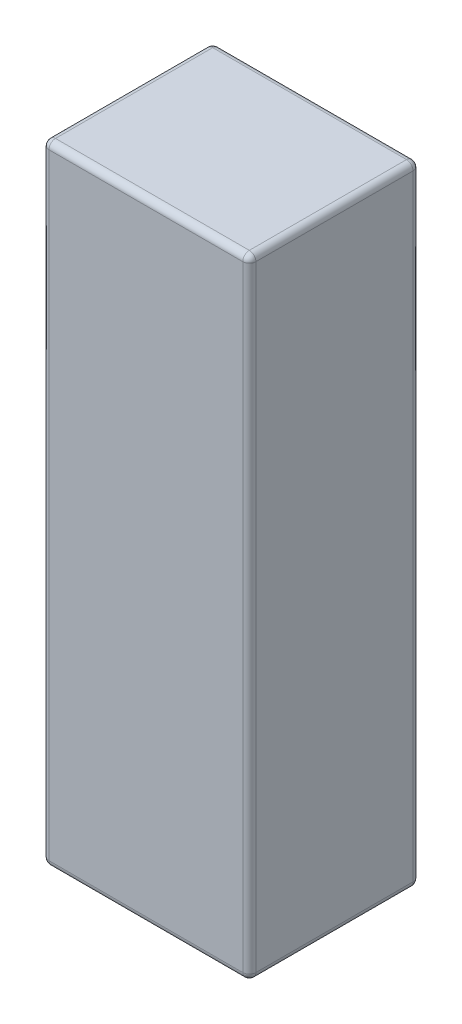
ISO-10303-21;
HEADER;
FILE_DESCRIPTION(('STEP AP214'),'2;1');
FILE_NAME('part.step','',(''),(''),'','','');
FILE_SCHEMA(('AUTOMOTIVE_DESIGN { 1 0 10303 214 1 1 1 1 }'));
ENDSEC;
DATA;
#1=APPLICATION_CONTEXT('core data for automotive mechanical design processes');
#2=APPLICATION_PROTOCOL_DEFINITION('international standard','automotive_design',2000,#1);
#3=PRODUCT_CONTEXT('',#1,'mechanical');
#4=PRODUCT('Part','Part','',(#3));
#5=PRODUCT_RELATED_PRODUCT_CATEGORY('part','',(#4));
#6=PRODUCT_DEFINITION_FORMATION('','',#4);
#7=PRODUCT_DEFINITION_CONTEXT('part definition',#1,'design');
#8=PRODUCT_DEFINITION('design','',#6,#7);
#9=PRODUCT_DEFINITION_SHAPE('','',#8);
#10=(LENGTH_UNIT() NAMED_UNIT(*) SI_UNIT(.MILLI.,.METRE.));
#11=(NAMED_UNIT(*) PLANE_ANGLE_UNIT() SI_UNIT($,.RADIAN.));
#12=(NAMED_UNIT(*) SI_UNIT($,.STERADIAN.) SOLID_ANGLE_UNIT());
#13=UNCERTAINTY_MEASURE_WITH_UNIT(LENGTH_MEASURE(1.E-05),#10,'distance_accuracy_value','');
#14=(GEOMETRIC_REPRESENTATION_CONTEXT(3) GLOBAL_UNCERTAINTY_ASSIGNED_CONTEXT((#13)) GLOBAL_UNIT_ASSIGNED_CONTEXT((#10,
#11,#12)) REPRESENTATION_CONTEXT('',''));
#15=CARTESIAN_POINT('',(0.,0.,0.));
#16=DIRECTION('',(0.,0.,1.));
#17=DIRECTION('',(1.,0.,0.));
#18=AXIS2_PLACEMENT_3D('',#15,#16,#17);
#19=CARTESIAN_POINT('',(7.9,48.,-6.5));
#20=DIRECTION('',(-1.,0.,0.));
#21=DIRECTION('',(0.,0.,1.));
#22=AXIS2_PLACEMENT_3D('',#19,#20,#21);
#23=PLANE('',#22);
#24=DIRECTION('',(0.,-1.,0.));
#25=VECTOR('',#24,1.);
#26=CARTESIAN_POINT('',(7.9,48.,-6.));
#27=LINE('',#26,#25);
#28=CARTESIAN_POINT('',(7.9,0.5,-6.));
#29=VERTEX_POINT('',#28);
#30=CARTESIAN_POINT('',(7.9,47.5,-6.));
#31=VERTEX_POINT('',#30);
#32=EDGE_CURVE('E167',#29,#31,#27,.F.);
#33=ORIENTED_EDGE('',*,*,#32,.T.);
#34=DIRECTION('',(0.,0.,-1.));
#35=VECTOR('',#34,1.);
#36=CARTESIAN_POINT('',(7.9,47.5,6.5));
#37=LINE('',#36,#35);
#38=CARTESIAN_POINT('',(7.9,47.5,6.));
#39=VERTEX_POINT('',#38);
#40=EDGE_CURVE('E136',#31,#39,#37,.F.);
#41=ORIENTED_EDGE('',*,*,#40,.T.);
#42=DIRECTION('',(0.,-1.,0.));
#43=VECTOR('',#42,1.);
#44=CARTESIAN_POINT('',(7.9,48.,6.));
#45=LINE('',#44,#43);
#46=CARTESIAN_POINT('',(7.9,0.5,6.));
#47=VERTEX_POINT('',#46);
#48=EDGE_CURVE('E178',#39,#47,#45,.T.);
#49=ORIENTED_EDGE('',*,*,#48,.T.);
#50=DIRECTION('',(0.,0.,-1.));
#51=VECTOR('',#50,1.);
#52=CARTESIAN_POINT('',(7.9,0.5,-6.5));
#53=LINE('',#52,#51);
#54=EDGE_CURVE('E171',#47,#29,#53,.T.);
#55=ORIENTED_EDGE('',*,*,#54,.T.);
#56=EDGE_LOOP('',(#33,#41,#49,#55));
#57=FACE_BOUND('',#56,.T.);
#58=ADVANCED_FACE('F39',(#57),#23,.F.);
#59=CARTESIAN_POINT('',(-7.9,48.,-6.5));
#60=DIRECTION('',(0.,0.,1.));
#61=DIRECTION('',(1.,0.,0.));
#62=AXIS2_PLACEMENT_3D('',#59,#60,#61);
#63=PLANE('',#62);
#64=DIRECTION('',(-1.,0.,0.));
#65=VECTOR('',#64,1.);
#66=CARTESIAN_POINT('',(7.9,47.5,-6.5));
#67=LINE('',#66,#65);
#68=CARTESIAN_POINT('',(-7.4,47.5,-6.5));
#69=VERTEX_POINT('',#68);
#70=CARTESIAN_POINT('',(7.4,47.5,-6.5));
#71=VERTEX_POINT('',#70);
#72=EDGE_CURVE('E49',#69,#71,#67,.F.);
#73=ORIENTED_EDGE('',*,*,#72,.T.);
#74=DIRECTION('',(0.,-1.,0.));
#75=VECTOR('',#74,1.);
#76=CARTESIAN_POINT('',(7.4,48.,-6.5));
#77=LINE('',#76,#75);
#78=CARTESIAN_POINT('',(7.4,0.5,-6.5));
#79=VERTEX_POINT('',#78);
#80=EDGE_CURVE('E11',#71,#79,#77,.T.);
#81=ORIENTED_EDGE('',*,*,#80,.T.);
#82=DIRECTION('',(-1.,0.,0.));
#83=VECTOR('',#82,1.);
#84=CARTESIAN_POINT('',(-7.9,0.5,-6.5));
#85=LINE('',#84,#83);
#86=CARTESIAN_POINT('',(-7.4,0.5,-6.5));
#87=VERTEX_POINT('',#86);
#88=EDGE_CURVE('E222',#79,#87,#85,.T.);
#89=ORIENTED_EDGE('',*,*,#88,.T.);
#90=DIRECTION('',(0.,-1.,0.));
#91=VECTOR('',#90,1.);
#92=CARTESIAN_POINT('',(-7.4,48.,-6.5));
#93=LINE('',#92,#91);
#94=EDGE_CURVE('E60',#87,#69,#93,.F.);
#95=ORIENTED_EDGE('',*,*,#94,.T.);
#96=EDGE_LOOP('',(#73,#81,#89,#95));
#97=FACE_BOUND('',#96,.T.);
#98=ADVANCED_FACE('F374',(#97),#63,.F.);
#99=CARTESIAN_POINT('',(-7.9,48.,-6.5));
#100=DIRECTION('',(1.,0.,0.));
#101=DIRECTION('',(0.,0.,-1.));
#102=AXIS2_PLACEMENT_3D('',#99,#100,#101);
#103=PLANE('',#102);
#104=DIRECTION('',(0.,-1.,0.));
#105=VECTOR('',#104,1.);
#106=CARTESIAN_POINT('',(-7.9,48.,6.));
#107=LINE('',#106,#105);
#108=CARTESIAN_POINT('',(-7.9,0.5,6.));
#109=VERTEX_POINT('',#108);
#110=CARTESIAN_POINT('',(-7.9,47.5,6.));
#111=VERTEX_POINT('',#110);
#112=EDGE_CURVE('E215',#109,#111,#107,.F.);
#113=ORIENTED_EDGE('',*,*,#112,.T.);
#114=DIRECTION('',(0.,0.,1.));
#115=VECTOR('',#114,1.);
#116=CARTESIAN_POINT('',(-7.9,47.5,-6.5));
#117=LINE('',#116,#115);
#118=CARTESIAN_POINT('',(-7.9,47.5,-6.));
#119=VERTEX_POINT('',#118);
#120=EDGE_CURVE('E218',#111,#119,#117,.F.);
#121=ORIENTED_EDGE('',*,*,#120,.T.);
#122=DIRECTION('',(0.,-1.,0.));
#123=VECTOR('',#122,1.);
#124=CARTESIAN_POINT('',(-7.9,48.,-6.));
#125=LINE('',#124,#123);
#126=CARTESIAN_POINT('',(-7.9,0.5,-6.));
#127=VERTEX_POINT('',#126);
#128=EDGE_CURVE('E209',#119,#127,#125,.T.);
#129=ORIENTED_EDGE('',*,*,#128,.T.);
#130=DIRECTION('',(0.,0.,1.));
#131=VECTOR('',#130,1.);
#132=CARTESIAN_POINT('',(-7.9,0.5,-6.5));
#133=LINE('',#132,#131);
#134=EDGE_CURVE('E212',#127,#109,#133,.T.);
#135=ORIENTED_EDGE('',*,*,#134,.T.);
#136=EDGE_LOOP('',(#113,#121,#129,#135));
#137=FACE_BOUND('',#136,.T.);
#138=ADVANCED_FACE('F353',(#137),#103,.F.);
#139=CARTESIAN_POINT('',(-7.9,48.,6.5));
#140=DIRECTION('',(0.,0.,-1.));
#141=DIRECTION('',(-1.,0.,0.));
#142=AXIS2_PLACEMENT_3D('',#139,#140,#141);
#143=PLANE('',#142);
#144=DIRECTION('',(0.,-1.,0.));
#145=VECTOR('',#144,1.);
#146=CARTESIAN_POINT('',(7.4,48.,6.5));
#147=LINE('',#146,#145);
#148=CARTESIAN_POINT('',(7.4,0.5,6.5));
#149=VERTEX_POINT('',#148);
#150=CARTESIAN_POINT('',(7.4,47.5,6.5));
#151=VERTEX_POINT('',#150);
#152=EDGE_CURVE('E189',#149,#151,#147,.F.);
#153=ORIENTED_EDGE('',*,*,#152,.T.);
#154=DIRECTION('',(1.,0.,0.));
#155=VECTOR('',#154,1.);
#156=CARTESIAN_POINT('',(-7.9,47.5,6.5));
#157=LINE('',#156,#155);
#158=CARTESIAN_POINT('',(-7.4,47.5,6.5));
#159=VERTEX_POINT('',#158);
#160=EDGE_CURVE('E192',#151,#159,#157,.F.);
#161=ORIENTED_EDGE('',*,*,#160,.T.);
#162=DIRECTION('',(0.,-1.,0.));
#163=VECTOR('',#162,1.);
#164=CARTESIAN_POINT('',(-7.4,48.,6.5));
#165=LINE('',#164,#163);
#166=CARTESIAN_POINT('',(-7.4,0.5,6.5));
#167=VERTEX_POINT('',#166);
#168=EDGE_CURVE('E183',#159,#167,#165,.T.);
#169=ORIENTED_EDGE('',*,*,#168,.T.);
#170=DIRECTION('',(1.,0.,0.));
#171=VECTOR('',#170,1.);
#172=CARTESIAN_POINT('',(-7.9,0.5,6.5));
#173=LINE('',#172,#171);
#174=EDGE_CURVE('E186',#167,#149,#173,.T.);
#175=ORIENTED_EDGE('',*,*,#174,.T.);
#176=EDGE_LOOP('',(#153,#161,#169,#175));
#177=FACE_BOUND('',#176,.T.);
#178=ADVANCED_FACE('F339',(#177),#143,.F.);
#179=CARTESIAN_POINT('',(0.,48.,0.));
#180=DIRECTION('',(0.,1.,0.));
#181=DIRECTION('',(0.,0.,1.));
#182=AXIS2_PLACEMENT_3D('',#179,#180,#181);
#183=PLANE('',#182);
#184=DIRECTION('',(1.,0.,0.));
#185=VECTOR('',#184,1.);
#186=CARTESIAN_POINT('',(7.9,48.,6.));
#187=LINE('',#186,#185);
#188=CARTESIAN_POINT('',(-7.4,48.,6.));
#189=VERTEX_POINT('',#188);
#190=CARTESIAN_POINT('',(7.4,48.,6.));
#191=VERTEX_POINT('',#190);
#192=EDGE_CURVE('E164',#189,#191,#187,.T.);
#193=ORIENTED_EDGE('',*,*,#192,.T.);
#194=DIRECTION('',(0.,0.,-1.));
#195=VECTOR('',#194,1.);
#196=CARTESIAN_POINT('',(7.4,48.,-6.5));
#197=LINE('',#196,#195);
#198=CARTESIAN_POINT('',(7.4,48.,-6.));
#199=VERTEX_POINT('',#198);
#200=EDGE_CURVE('E134',#191,#199,#197,.T.);
#201=ORIENTED_EDGE('',*,*,#200,.T.);
#202=DIRECTION('',(-1.,0.,0.));
#203=VECTOR('',#202,1.);
#204=CARTESIAN_POINT('',(-7.9,48.,-6.));
#205=LINE('',#204,#203);
#206=CARTESIAN_POINT('',(-7.4,48.,-6.));
#207=VERTEX_POINT('',#206);
#208=EDGE_CURVE('E153',#199,#207,#205,.T.);
#209=ORIENTED_EDGE('',*,*,#208,.T.);
#210=DIRECTION('',(0.,0.,1.));
#211=VECTOR('',#210,1.);
#212=CARTESIAN_POINT('',(-7.4,48.,6.5));
#213=LINE('',#212,#211);
#214=EDGE_CURVE('E160',#207,#189,#213,.T.);
#215=ORIENTED_EDGE('',*,*,#214,.T.);
#216=EDGE_LOOP('',(#193,#201,#209,#215));
#217=FACE_BOUND('',#216,.T.);
#218=ADVANCED_FACE('F162',(#217),#183,.T.);
#219=CARTESIAN_POINT('',(0.,0.,0.));
#220=DIRECTION('',(0.,1.,0.));
#221=DIRECTION('',(0.,0.,1.));
#222=AXIS2_PLACEMENT_3D('',#219,#220,#221);
#223=PLANE('',#222);
#224=DIRECTION('',(0.,0.,-1.));
#225=VECTOR('',#224,1.);
#226=CARTESIAN_POINT('',(7.4,0.,0.));
#227=LINE('',#226,#225);
#228=CARTESIAN_POINT('',(7.4,0.,-6.));
#229=VERTEX_POINT('',#228);
#230=CARTESIAN_POINT('',(7.4,0.,6.));
#231=VERTEX_POINT('',#230);
#232=EDGE_CURVE('E202',#229,#231,#227,.F.);
#233=ORIENTED_EDGE('',*,*,#232,.T.);
#234=DIRECTION('',(1.,0.,0.));
#235=VECTOR('',#234,1.);
#236=CARTESIAN_POINT('',(0.,0.,6.));
#237=LINE('',#236,#235);
#238=CARTESIAN_POINT('',(-7.4,0.,6.));
#239=VERTEX_POINT('',#238);
#240=EDGE_CURVE('E205',#231,#239,#237,.F.);
#241=ORIENTED_EDGE('',*,*,#240,.T.);
#242=DIRECTION('',(0.,0.,1.));
#243=VECTOR('',#242,1.);
#244=CARTESIAN_POINT('',(-7.4,0.,0.));
#245=LINE('',#244,#243);
#246=CARTESIAN_POINT('',(-7.4,0.,-6.));
#247=VERTEX_POINT('',#246);
#248=EDGE_CURVE('E199',#239,#247,#245,.F.);
#249=ORIENTED_EDGE('',*,*,#248,.T.);
#250=DIRECTION('',(-1.,0.,0.));
#251=VECTOR('',#250,1.);
#252=CARTESIAN_POINT('',(0.,0.,-6.));
#253=LINE('',#252,#251);
#254=EDGE_CURVE('E196',#247,#229,#253,.F.);
#255=ORIENTED_EDGE('',*,*,#254,.T.);
#256=EDGE_LOOP('',(#233,#241,#249,#255));
#257=FACE_BOUND('',#256,.T.);
#258=ADVANCED_FACE('F318',(#257),#223,.F.);
#259=CARTESIAN_POINT('',(-7.4,0.5,-6.5));
#260=DIRECTION('',(0.,0.,1.));
#261=DIRECTION('',(1.,0.,0.));
#262=AXIS2_PLACEMENT_3D('',#259,#260,#261);
#263=CYLINDRICAL_SURFACE('',#262,0.5);
#264=CARTESIAN_POINT('',(-7.4,0.5,6.));
#265=DIRECTION('',(0.,0.,1.));
#266=DIRECTION('',(1.,0.,0.));
#267=AXIS2_PLACEMENT_3D('',#264,#265,#266);
#268=CIRCLE('',#267,0.5);
#269=EDGE_CURVE('E43',#109,#239,#268,.T.);
#270=ORIENTED_EDGE('',*,*,#269,.F.);
#271=ORIENTED_EDGE('',*,*,#134,.F.);
#272=CARTESIAN_POINT('',(-7.4,0.5,-6.));
#273=DIRECTION('',(0.,0.,-1.));
#274=DIRECTION('',(-1.,0.,0.));
#275=AXIS2_PLACEMENT_3D('',#272,#273,#274);
#276=CIRCLE('',#275,0.5);
#277=EDGE_CURVE('E297',#247,#127,#276,.T.);
#278=ORIENTED_EDGE('',*,*,#277,.F.);
#279=ORIENTED_EDGE('',*,*,#248,.F.);
#280=EDGE_LOOP('',(#270,#271,#278,#279));
#281=FACE_BOUND('',#280,.T.);
#282=ADVANCED_FACE('F41',(#281),#263,.T.);
#283=CARTESIAN_POINT('',(-7.4,0.5,6.));
#284=DIRECTION('',(0.,0.,1.));
#285=DIRECTION('',(1.,0.,0.));
#286=AXIS2_PLACEMENT_3D('',#283,#284,#285);
#287=SPHERICAL_SURFACE('',#286,0.5);
#288=CARTESIAN_POINT('',(-7.4,0.5,6.));
#289=DIRECTION('',(0.,-1.,0.));
#290=DIRECTION('',(0.,0.,-1.));
#291=AXIS2_PLACEMENT_3D('',#288,#289,#290);
#292=CIRCLE('',#291,0.5);
#293=EDGE_CURVE('E291',#109,#167,#292,.F.);
#294=ORIENTED_EDGE('',*,*,#293,.F.);
#295=ORIENTED_EDGE('',*,*,#269,.T.);
#296=CARTESIAN_POINT('',(-7.4,0.5,6.));
#297=DIRECTION('',(-1.,0.,0.));
#298=DIRECTION('',(0.,0.,1.));
#299=AXIS2_PLACEMENT_3D('',#296,#297,#298);
#300=CIRCLE('',#299,0.5);
#301=EDGE_CURVE('E295',#167,#239,#300,.F.);
#302=ORIENTED_EDGE('',*,*,#301,.F.);
#303=EDGE_LOOP('',(#294,#295,#302));
#304=FACE_BOUND('',#303,.T.);
#305=ADVANCED_FACE('F311',(#304),#287,.T.);
#306=CARTESIAN_POINT('',(-7.4,0.5,-6.));
#307=DIRECTION('',(0.,0.,1.));
#308=DIRECTION('',(1.,0.,0.));
#309=AXIS2_PLACEMENT_3D('',#306,#307,#308);
#310=SPHERICAL_SURFACE('',#309,0.5);
#311=CARTESIAN_POINT('',(-7.4,0.5,-6.));
#312=DIRECTION('',(-1.,0.,0.));
#313=DIRECTION('',(0.,0.,1.));
#314=AXIS2_PLACEMENT_3D('',#311,#312,#313);
#315=CIRCLE('',#314,0.5);
#316=EDGE_CURVE('E283',#247,#87,#315,.F.);
#317=ORIENTED_EDGE('',*,*,#316,.F.);
#318=ORIENTED_EDGE('',*,*,#277,.T.);
#319=CARTESIAN_POINT('',(-7.4,0.5,-6.));
#320=DIRECTION('',(0.,-1.,0.));
#321=DIRECTION('',(0.,0.,-1.));
#322=AXIS2_PLACEMENT_3D('',#319,#320,#321);
#323=CIRCLE('',#322,0.5);
#324=EDGE_CURVE('E287',#87,#127,#323,.F.);
#325=ORIENTED_EDGE('',*,*,#324,.F.);
#326=EDGE_LOOP('',(#317,#318,#325));
#327=FACE_BOUND('',#326,.T.);
#328=ADVANCED_FACE('F361',(#327),#310,.T.);
#329=CARTESIAN_POINT('',(-7.9,0.5,6.));
#330=DIRECTION('',(1.,0.,0.));
#331=DIRECTION('',(0.,0.,-1.));
#332=AXIS2_PLACEMENT_3D('',#329,#330,#331);
#333=CYLINDRICAL_SURFACE('',#332,0.5);
#334=ORIENTED_EDGE('',*,*,#301,.T.);
#335=ORIENTED_EDGE('',*,*,#240,.F.);
#336=CARTESIAN_POINT('',(7.4,0.5,6.));
#337=DIRECTION('',(1.,0.,0.));
#338=DIRECTION('',(0.,0.,-1.));
#339=AXIS2_PLACEMENT_3D('',#336,#337,#338);
#340=CIRCLE('',#339,0.5);
#341=EDGE_CURVE('E275',#149,#231,#340,.T.);
#342=ORIENTED_EDGE('',*,*,#341,.F.);
#343=ORIENTED_EDGE('',*,*,#174,.F.);
#344=EDGE_LOOP('',(#334,#335,#342,#343));
#345=FACE_BOUND('',#344,.T.);
#346=ADVANCED_FACE('F323',(#345),#333,.T.);
#347=CARTESIAN_POINT('',(-7.4,48.,6.));
#348=DIRECTION('',(0.,-1.,0.));
#349=DIRECTION('',(0.,0.,-1.));
#350=AXIS2_PLACEMENT_3D('',#347,#348,#349);
#351=CYLINDRICAL_SURFACE('',#350,0.5);
#352=ORIENTED_EDGE('',*,*,#293,.T.);
#353=ORIENTED_EDGE('',*,*,#168,.F.);
#354=CARTESIAN_POINT('',(-7.4,47.5,6.));
#355=DIRECTION('',(0.,1.,0.));
#356=DIRECTION('',(0.,0.,1.));
#357=AXIS2_PLACEMENT_3D('',#354,#355,#356);
#358=CIRCLE('',#357,0.5);
#359=EDGE_CURVE('E271',#111,#159,#358,.T.);
#360=ORIENTED_EDGE('',*,*,#359,.F.);
#361=ORIENTED_EDGE('',*,*,#112,.F.);
#362=EDGE_LOOP('',(#352,#353,#360,#361));
#363=FACE_BOUND('',#362,.T.);
#364=ADVANCED_FACE('F350',(#363),#351,.T.);
#365=CARTESIAN_POINT('',(-7.4,47.5,0.));
#366=DIRECTION('',(0.,0.,-1.));
#367=DIRECTION('',(-1.,0.,0.));
#368=AXIS2_PLACEMENT_3D('',#365,#366,#367);
#369=CYLINDRICAL_SURFACE('',#368,0.5);
#370=CARTESIAN_POINT('',(-7.4,47.5,-6.));
#371=DIRECTION('',(0.,0.,-1.));
#372=DIRECTION('',(-1.,0.,0.));
#373=AXIS2_PLACEMENT_3D('',#370,#371,#372);
#374=CIRCLE('',#373,0.5);
#375=EDGE_CURVE('E263',#119,#207,#374,.T.);
#376=ORIENTED_EDGE('',*,*,#375,.F.);
#377=ORIENTED_EDGE('',*,*,#120,.F.);
#378=CARTESIAN_POINT('',(-7.4,47.5,6.));
#379=DIRECTION('',(0.,0.,1.));
#380=DIRECTION('',(1.,0.,0.));
#381=AXIS2_PLACEMENT_3D('',#378,#379,#380);
#382=CIRCLE('',#381,0.5);
#383=EDGE_CURVE('E267',#189,#111,#382,.T.);
#384=ORIENTED_EDGE('',*,*,#383,.F.);
#385=ORIENTED_EDGE('',*,*,#214,.F.);
#386=EDGE_LOOP('',(#376,#377,#384,#385));
#387=FACE_BOUND('',#386,.T.);
#388=ADVANCED_FACE('F356',(#387),#369,.T.);
#389=CARTESIAN_POINT('',(-7.4,48.,-6.));
#390=DIRECTION('',(0.,-1.,0.));
#391=DIRECTION('',(0.,0.,-1.));
#392=AXIS2_PLACEMENT_3D('',#389,#390,#391);
#393=CYLINDRICAL_SURFACE('',#392,0.5);
#394=ORIENTED_EDGE('',*,*,#324,.T.);
#395=ORIENTED_EDGE('',*,*,#128,.F.);
#396=CARTESIAN_POINT('',(-7.4,47.5,-6.));
#397=DIRECTION('',(0.,1.,0.));
#398=DIRECTION('',(0.,0.,1.));
#399=AXIS2_PLACEMENT_3D('',#396,#397,#398);
#400=CIRCLE('',#399,0.5);
#401=EDGE_CURVE('E260',#69,#119,#400,.T.);
#402=ORIENTED_EDGE('',*,*,#401,.F.);
#403=ORIENTED_EDGE('',*,*,#94,.F.);
#404=EDGE_LOOP('',(#394,#395,#402,#403));
#405=FACE_BOUND('',#404,.T.);
#406=ADVANCED_FACE('F360',(#405),#393,.T.);
#407=CARTESIAN_POINT('',(-7.9,0.5,-6.));
#408=DIRECTION('',(-1.,0.,0.));
#409=DIRECTION('',(0.,0.,1.));
#410=AXIS2_PLACEMENT_3D('',#407,#408,#409);
#411=CYLINDRICAL_SURFACE('',#410,0.5);
#412=ORIENTED_EDGE('',*,*,#316,.T.);
#413=ORIENTED_EDGE('',*,*,#88,.F.);
#414=CARTESIAN_POINT('',(7.4,0.5,-6.));
#415=DIRECTION('',(1.,0.,0.));
#416=DIRECTION('',(0.,0.,-1.));
#417=AXIS2_PLACEMENT_3D('',#414,#415,#416);
#418=CIRCLE('',#417,0.5);
#419=EDGE_CURVE('E256',#229,#79,#418,.T.);
#420=ORIENTED_EDGE('',*,*,#419,.F.);
#421=ORIENTED_EDGE('',*,*,#254,.F.);
#422=EDGE_LOOP('',(#412,#413,#420,#421));
#423=FACE_BOUND('',#422,.T.);
#424=ADVANCED_FACE('F365',(#423),#411,.T.);
#425=CARTESIAN_POINT('',(7.4,0.5,-6.5));
#426=DIRECTION('',(0.,0.,-1.));
#427=DIRECTION('',(-1.,0.,0.));
#428=AXIS2_PLACEMENT_3D('',#425,#426,#427);
#429=CYLINDRICAL_SURFACE('',#428,0.5);
#430=CARTESIAN_POINT('',(7.4,0.5,6.));
#431=DIRECTION('',(0.,0.,1.));
#432=DIRECTION('',(1.,0.,0.));
#433=AXIS2_PLACEMENT_3D('',#430,#431,#432);
#434=CIRCLE('',#433,0.5);
#435=EDGE_CURVE('E279',#231,#47,#434,.T.);
#436=ORIENTED_EDGE('',*,*,#435,.F.);
#437=ORIENTED_EDGE('',*,*,#232,.F.);
#438=CARTESIAN_POINT('',(7.4,0.5,-6.));
#439=DIRECTION('',(0.,0.,-1.));
#440=DIRECTION('',(-1.,0.,0.));
#441=AXIS2_PLACEMENT_3D('',#438,#439,#440);
#442=CIRCLE('',#441,0.5);
#443=EDGE_CURVE('E252',#29,#229,#442,.T.);
#444=ORIENTED_EDGE('',*,*,#443,.F.);
#445=ORIENTED_EDGE('',*,*,#54,.F.);
#446=EDGE_LOOP('',(#436,#437,#444,#445));
#447=FACE_BOUND('',#446,.T.);
#448=ADVANCED_FACE('F327',(#447),#429,.T.);
#449=CARTESIAN_POINT('',(7.4,0.5,6.));
#450=DIRECTION('',(0.,0.,1.));
#451=DIRECTION('',(1.,0.,0.));
#452=AXIS2_PLACEMENT_3D('',#449,#450,#451);
#453=SPHERICAL_SURFACE('',#452,0.5);
#454=ORIENTED_EDGE('',*,*,#341,.T.);
#455=ORIENTED_EDGE('',*,*,#435,.T.);
#456=CARTESIAN_POINT('',(7.4,0.5,6.));
#457=DIRECTION('',(0.,-1.,0.));
#458=DIRECTION('',(0.,0.,-1.));
#459=AXIS2_PLACEMENT_3D('',#456,#457,#458);
#460=CIRCLE('',#459,0.5);
#461=EDGE_CURVE('E248',#149,#47,#460,.F.);
#462=ORIENTED_EDGE('',*,*,#461,.F.);
#463=EDGE_LOOP('',(#454,#455,#462));
#464=FACE_BOUND('',#463,.T.);
#465=ADVANCED_FACE('F331',(#464),#453,.T.);
#466=CARTESIAN_POINT('',(-7.4,47.5,6.));
#467=DIRECTION('',(0.,0.,1.));
#468=DIRECTION('',(1.,0.,0.));
#469=AXIS2_PLACEMENT_3D('',#466,#467,#468);
#470=SPHERICAL_SURFACE('',#469,0.5);
#471=ORIENTED_EDGE('',*,*,#383,.T.);
#472=ORIENTED_EDGE('',*,*,#359,.T.);
#473=CARTESIAN_POINT('',(-7.4,47.5,6.));
#474=DIRECTION('',(-1.,0.,0.));
#475=DIRECTION('',(0.,0.,1.));
#476=AXIS2_PLACEMENT_3D('',#473,#474,#475);
#477=CIRCLE('',#476,0.5);
#478=EDGE_CURVE('E245',#189,#159,#477,.F.);
#479=ORIENTED_EDGE('',*,*,#478,.F.);
#480=EDGE_LOOP('',(#471,#472,#479));
#481=FACE_BOUND('',#480,.T.);
#482=ADVANCED_FACE('F347',(#481),#470,.T.);
#483=CARTESIAN_POINT('',(-7.4,47.5,-6.));
#484=DIRECTION('',(0.,0.,1.));
#485=DIRECTION('',(1.,0.,0.));
#486=AXIS2_PLACEMENT_3D('',#483,#484,#485);
#487=SPHERICAL_SURFACE('',#486,0.5);
#488=ORIENTED_EDGE('',*,*,#401,.T.);
#489=ORIENTED_EDGE('',*,*,#375,.T.);
#490=CARTESIAN_POINT('',(-7.4,47.5,-6.));
#491=DIRECTION('',(-1.,0.,0.));
#492=DIRECTION('',(0.,0.,1.));
#493=AXIS2_PLACEMENT_3D('',#490,#491,#492);
#494=CIRCLE('',#493,0.5);
#495=EDGE_CURVE('E156',#69,#207,#494,.F.);
#496=ORIENTED_EDGE('',*,*,#495,.F.);
#497=EDGE_LOOP('',(#488,#489,#496));
#498=FACE_BOUND('',#497,.T.);
#499=ADVANCED_FACE('F400',(#498),#487,.T.);
#500=CARTESIAN_POINT('',(7.4,0.5,-6.));
#501=DIRECTION('',(0.,0.,1.));
#502=DIRECTION('',(1.,0.,0.));
#503=AXIS2_PLACEMENT_3D('',#500,#501,#502);
#504=SPHERICAL_SURFACE('',#503,0.5);
#505=ORIENTED_EDGE('',*,*,#443,.T.);
#506=ORIENTED_EDGE('',*,*,#419,.T.);
#507=CARTESIAN_POINT('',(7.4,0.5,-6.));
#508=DIRECTION('',(0.,-1.,0.));
#509=DIRECTION('',(0.,0.,-1.));
#510=AXIS2_PLACEMENT_3D('',#507,#508,#509);
#511=CIRCLE('',#510,0.5);
#512=EDGE_CURVE('E240',#29,#79,#511,.F.);
#513=ORIENTED_EDGE('',*,*,#512,.F.);
#514=EDGE_LOOP('',(#505,#506,#513));
#515=FACE_BOUND('',#514,.T.);
#516=ADVANCED_FACE('F368',(#515),#504,.T.);
#517=CARTESIAN_POINT('',(7.4,48.,6.));
#518=DIRECTION('',(0.,-1.,0.));
#519=DIRECTION('',(0.,0.,-1.));
#520=AXIS2_PLACEMENT_3D('',#517,#518,#519);
#521=CYLINDRICAL_SURFACE('',#520,0.5);
#522=ORIENTED_EDGE('',*,*,#461,.T.);
#523=ORIENTED_EDGE('',*,*,#48,.F.);
#524=CARTESIAN_POINT('',(7.4,47.5,6.));
#525=DIRECTION('',(0.,1.,0.));
#526=DIRECTION('',(0.,0.,1.));
#527=AXIS2_PLACEMENT_3D('',#524,#525,#526);
#528=CIRCLE('',#527,0.5);
#529=EDGE_CURVE('E236',#151,#39,#528,.T.);
#530=ORIENTED_EDGE('',*,*,#529,.F.);
#531=ORIENTED_EDGE('',*,*,#152,.F.);
#532=EDGE_LOOP('',(#522,#523,#530,#531));
#533=FACE_BOUND('',#532,.T.);
#534=ADVANCED_FACE('F336',(#533),#521,.T.);
#535=CARTESIAN_POINT('',(0.,47.5,6.));
#536=DIRECTION('',(-1.,0.,0.));
#537=DIRECTION('',(0.,0.,1.));
#538=AXIS2_PLACEMENT_3D('',#535,#536,#537);
#539=CYLINDRICAL_SURFACE('',#538,0.5);
#540=ORIENTED_EDGE('',*,*,#478,.T.);
#541=ORIENTED_EDGE('',*,*,#160,.F.);
#542=CARTESIAN_POINT('',(7.4,47.5,6.));
#543=DIRECTION('',(1.,0.,0.));
#544=DIRECTION('',(0.,0.,-1.));
#545=AXIS2_PLACEMENT_3D('',#542,#543,#544);
#546=CIRCLE('',#545,0.5);
#547=EDGE_CURVE('E150',#191,#151,#546,.T.);
#548=ORIENTED_EDGE('',*,*,#547,.F.);
#549=ORIENTED_EDGE('',*,*,#192,.F.);
#550=EDGE_LOOP('',(#540,#541,#548,#549));
#551=FACE_BOUND('',#550,.T.);
#552=ADVANCED_FACE('F341',(#551),#539,.T.);
#553=CARTESIAN_POINT('',(0.,47.5,-6.));
#554=DIRECTION('',(1.,0.,0.));
#555=DIRECTION('',(0.,0.,-1.));
#556=AXIS2_PLACEMENT_3D('',#553,#554,#555);
#557=CYLINDRICAL_SURFACE('',#556,0.5);
#558=ORIENTED_EDGE('',*,*,#495,.T.);
#559=ORIENTED_EDGE('',*,*,#208,.F.);
#560=CARTESIAN_POINT('',(7.4,47.5,-6.));
#561=DIRECTION('',(1.,0.,0.));
#562=DIRECTION('',(0.,0.,-1.));
#563=AXIS2_PLACEMENT_3D('',#560,#561,#562);
#564=CIRCLE('',#563,0.5);
#565=EDGE_CURVE('E143',#71,#199,#564,.T.);
#566=ORIENTED_EDGE('',*,*,#565,.F.);
#567=ORIENTED_EDGE('',*,*,#72,.F.);
#568=EDGE_LOOP('',(#558,#559,#566,#567));
#569=FACE_BOUND('',#568,.T.);
#570=ADVANCED_FACE('F154',(#569),#557,.T.);
#571=CARTESIAN_POINT('',(7.4,48.,-6.));
#572=DIRECTION('',(0.,-1.,0.));
#573=DIRECTION('',(0.,0.,-1.));
#574=AXIS2_PLACEMENT_3D('',#571,#572,#573);
#575=CYLINDRICAL_SURFACE('',#574,0.5);
#576=ORIENTED_EDGE('',*,*,#512,.T.);
#577=ORIENTED_EDGE('',*,*,#80,.F.);
#578=CARTESIAN_POINT('',(7.4,47.5,-6.));
#579=DIRECTION('',(0.,1.,0.));
#580=DIRECTION('',(0.,0.,1.));
#581=AXIS2_PLACEMENT_3D('',#578,#579,#580);
#582=CIRCLE('',#581,0.5);
#583=EDGE_CURVE('E147',#31,#71,#582,.T.);
#584=ORIENTED_EDGE('',*,*,#583,.F.);
#585=ORIENTED_EDGE('',*,*,#32,.F.);
#586=EDGE_LOOP('',(#576,#577,#584,#585));
#587=FACE_BOUND('',#586,.T.);
#588=ADVANCED_FACE('F371',(#587),#575,.T.);
#589=CARTESIAN_POINT('',(7.4,47.5,6.));
#590=DIRECTION('',(0.,0.,1.));
#591=DIRECTION('',(1.,0.,0.));
#592=AXIS2_PLACEMENT_3D('',#589,#590,#591);
#593=SPHERICAL_SURFACE('',#592,0.5);
#594=ORIENTED_EDGE('',*,*,#547,.T.);
#595=ORIENTED_EDGE('',*,*,#529,.T.);
#596=CARTESIAN_POINT('',(7.4,47.5,6.));
#597=DIRECTION('',(0.,0.,1.));
#598=DIRECTION('',(0.,-1.,0.));
#599=AXIS2_PLACEMENT_3D('',#596,#597,#598);
#600=CIRCLE('',#599,0.5);
#601=EDGE_CURVE('E140',#191,#39,#600,.F.);
#602=ORIENTED_EDGE('',*,*,#601,.F.);
#603=EDGE_LOOP('',(#594,#595,#602));
#604=FACE_BOUND('',#603,.T.);
#605=ADVANCED_FACE('F386',(#604),#593,.T.);
#606=CARTESIAN_POINT('',(7.4,47.5,-6.));
#607=DIRECTION('',(0.,0.,1.));
#608=DIRECTION('',(1.,0.,0.));
#609=AXIS2_PLACEMENT_3D('',#606,#607,#608);
#610=SPHERICAL_SURFACE('',#609,0.5);
#611=ORIENTED_EDGE('',*,*,#583,.T.);
#612=ORIENTED_EDGE('',*,*,#565,.T.);
#613=CARTESIAN_POINT('',(7.4,47.5,-6.));
#614=DIRECTION('',(0.,0.,-1.));
#615=DIRECTION('',(-1.,0.,0.));
#616=AXIS2_PLACEMENT_3D('',#613,#614,#615);
#617=CIRCLE('',#616,0.5);
#618=EDGE_CURVE('E130',#31,#199,#617,.F.);
#619=ORIENTED_EDGE('',*,*,#618,.F.);
#620=EDGE_LOOP('',(#611,#612,#619));
#621=FACE_BOUND('',#620,.T.);
#622=ADVANCED_FACE('F145',(#621),#610,.T.);
#623=CARTESIAN_POINT('',(7.4,47.5,0.));
#624=DIRECTION('',(0.,0.,1.));
#625=DIRECTION('',(1.,0.,0.));
#626=AXIS2_PLACEMENT_3D('',#623,#624,#625);
#627=CYLINDRICAL_SURFACE('',#626,0.5);
#628=ORIENTED_EDGE('',*,*,#601,.T.);
#629=ORIENTED_EDGE('',*,*,#40,.F.);
#630=ORIENTED_EDGE('',*,*,#618,.T.);
#631=ORIENTED_EDGE('',*,*,#200,.F.);
#632=EDGE_LOOP('',(#628,#629,#630,#631));
#633=FACE_BOUND('',#632,.T.);
#634=ADVANCED_FACE('F132',(#633),#627,.T.);
#635=CLOSED_SHELL('',(#58,#98,#138,#178,#218,#258,#282,#305,#328,#346,#364,#388,#406,#424,#448,
#465,#482,#499,#516,#534,#552,#570,#588,#605,#622,#634));
#636=MANIFOLD_SOLID_BREP('B2',#635);
#637=ADVANCED_BREP_SHAPE_REPRESENTATION('',(#18,#636),#14);
#638=SHAPE_DEFINITION_REPRESENTATION(#9,#637);
ENDSEC;
END-ISO-10303-21;
